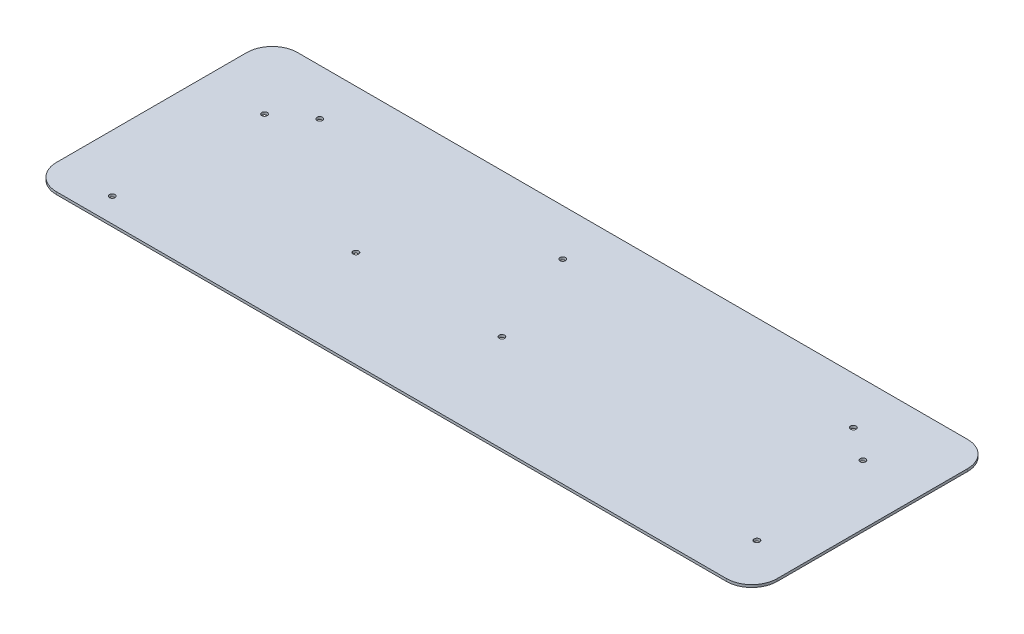
ISO-10303-21;
HEADER;
FILE_DESCRIPTION(('STEP AP214'),'2;1');
FILE_NAME('part.step','',(''),(''),'','','');
FILE_SCHEMA(('AUTOMOTIVE_DESIGN { 1 0 10303 214 1 1 1 1 }'));
ENDSEC;
DATA;
#1=APPLICATION_CONTEXT('core data for automotive mechanical design processes');
#2=APPLICATION_PROTOCOL_DEFINITION('international standard','automotive_design',2000,#1);
#3=PRODUCT_CONTEXT('',#1,'mechanical');
#4=PRODUCT('Part','Part','',(#3));
#5=PRODUCT_RELATED_PRODUCT_CATEGORY('part','',(#4));
#6=PRODUCT_DEFINITION_FORMATION('','',#4);
#7=PRODUCT_DEFINITION_CONTEXT('part definition',#1,'design');
#8=PRODUCT_DEFINITION('design','',#6,#7);
#9=PRODUCT_DEFINITION_SHAPE('','',#8);
#10=(LENGTH_UNIT() NAMED_UNIT(*) SI_UNIT(.MILLI.,.METRE.));
#11=(NAMED_UNIT(*) PLANE_ANGLE_UNIT() SI_UNIT($,.RADIAN.));
#12=(NAMED_UNIT(*) SI_UNIT($,.STERADIAN.) SOLID_ANGLE_UNIT());
#13=UNCERTAINTY_MEASURE_WITH_UNIT(LENGTH_MEASURE(1.E-05),#10,'distance_accuracy_value','');
#14=(GEOMETRIC_REPRESENTATION_CONTEXT(3) GLOBAL_UNCERTAINTY_ASSIGNED_CONTEXT((#13)) GLOBAL_UNIT_ASSIGNED_CONTEXT((#10,
#11,#12)) REPRESENTATION_CONTEXT('',''));
#15=CARTESIAN_POINT('',(0.,0.,0.));
#16=DIRECTION('',(0.,0.,1.));
#17=DIRECTION('',(1.,0.,0.));
#18=AXIS2_PLACEMENT_3D('',#15,#16,#17);
#19=CARTESIAN_POINT('',(0.,0.,0.));
#20=DIRECTION('',(0.,-1.,0.));
#21=DIRECTION('',(0.,0.,-1.));
#22=AXIS2_PLACEMENT_3D('',#19,#20,#21);
#23=PLANE('',#22);
#24=CARTESIAN_POINT('',(48.2656569231473,0.,-388.514519521558));
#25=DIRECTION('',(0.,1.,0.));
#26=DIRECTION('',(0.,0.,1.));
#27=AXIS2_PLACEMENT_3D('',#24,#25,#26);
#28=CIRCLE('',#27,1.1);
#29=CARTESIAN_POINT('',(48.2656569231473,0.,-387.414519521558));
#30=VERTEX_POINT('',#29);
#31=EDGE_CURVE('E225',#30,#30,#28,.T.);
#32=ORIENTED_EDGE('',*,*,#31,.T.);
#33=EDGE_LOOP('',(#32));
#34=FACE_BOUND('',#33,.T.);
#35=CARTESIAN_POINT('',(60.7656569231473,0.,-397.764519521558));
#36=DIRECTION('',(0.,1.,0.));
#37=DIRECTION('',(0.,0.,1.));
#38=AXIS2_PLACEMENT_3D('',#35,#36,#37);
#39=CIRCLE('',#38,1.1);
#40=CARTESIAN_POINT('',(60.7656569231473,0.,-396.664519521558));
#41=VERTEX_POINT('',#40);
#42=EDGE_CURVE('E219',#41,#41,#39,.T.);
#43=ORIENTED_EDGE('',*,*,#42,.T.);
#44=EDGE_LOOP('',(#43));
#45=FACE_BOUND('',#44,.T.);
#46=CARTESIAN_POINT('',(46.2656569231473,0.,-330.514519521558));
#47=DIRECTION('',(0.,1.,0.));
#48=DIRECTION('',(0.,0.,1.));
#49=AXIS2_PLACEMENT_3D('',#46,#47,#48);
#50=CIRCLE('',#49,1.1);
#51=CARTESIAN_POINT('',(46.2656569231473,0.,-329.414519521558));
#52=VERTEX_POINT('',#51);
#53=EDGE_CURVE('E213',#52,#52,#50,.T.);
#54=ORIENTED_EDGE('',*,*,#53,.T.);
#55=EDGE_LOOP('',(#54));
#56=FACE_BOUND('',#55,.T.);
#57=CARTESIAN_POINT('',(113.515656923147,0.,-359.264519521558));
#58=DIRECTION('',(0.,1.,0.));
#59=DIRECTION('',(0.,0.,1.));
#60=AXIS2_PLACEMENT_3D('',#57,#58,#59);
#61=CIRCLE('',#60,1.1);
#62=CARTESIAN_POINT('',(113.515656923147,0.,-358.164519521558));
#63=VERTEX_POINT('',#62);
#64=EDGE_CURVE('E207',#63,#63,#61,.T.);
#65=ORIENTED_EDGE('',*,*,#64,.T.);
#66=EDGE_LOOP('',(#65));
#67=FACE_BOUND('',#66,.T.);
#68=CARTESIAN_POINT('',(156.515656923147,0.,-397.764519521558));
#69=DIRECTION('',(0.,1.,0.));
#70=DIRECTION('',(0.,0.,1.));
#71=AXIS2_PLACEMENT_3D('',#68,#69,#70);
#72=CIRCLE('',#71,1.09999999999999);
#73=CARTESIAN_POINT('',(156.515656923147,0.,-396.664519521558));
#74=VERTEX_POINT('',#73);
#75=EDGE_CURVE('E201',#74,#74,#72,.T.);
#76=ORIENTED_EDGE('',*,*,#75,.T.);
#77=EDGE_LOOP('',(#76));
#78=FACE_BOUND('',#77,.T.);
#79=DIRECTION('',(-1.,0.,0.));
#80=VECTOR('',#79,1.);
#81=CARTESIAN_POINT('',(23.7656569231473,0.,-416.014519521558));
#82=LINE('',#81,#80);
#83=CARTESIAN_POINT('',(297.765656923147,0.,-416.014519521558));
#84=VERTEX_POINT('',#83);
#85=CARTESIAN_POINT('',(33.7656569231473,0.,-416.014519521558));
#86=VERTEX_POINT('',#85);
#87=EDGE_CURVE('E123',#84,#86,#82,.T.);
#88=ORIENTED_EDGE('',*,*,#87,.F.);
#89=CARTESIAN_POINT('',(297.765656923147,0.,-406.014519521558));
#90=DIRECTION('',(0.,-1.,0.));
#91=DIRECTION('',(0.,0.,-1.));
#92=AXIS2_PLACEMENT_3D('',#89,#90,#91);
#93=CIRCLE('',#92,10.);
#94=CARTESIAN_POINT('',(307.765656923147,0.,-406.014519521558));
#95=VERTEX_POINT('',#94);
#96=EDGE_CURVE('E106',#84,#95,#93,.T.);
#97=ORIENTED_EDGE('',*,*,#96,.T.);
#98=DIRECTION('',(0.,0.,-1.));
#99=VECTOR('',#98,1.);
#100=CARTESIAN_POINT('',(307.765656923147,0.,-321.014519521558));
#101=LINE('',#100,#99);
#102=CARTESIAN_POINT('',(307.765656923147,0.,-331.014519521558));
#103=VERTEX_POINT('',#102);
#104=EDGE_CURVE('E133',#103,#95,#101,.T.);
#105=ORIENTED_EDGE('',*,*,#104,.F.);
#106=CARTESIAN_POINT('',(297.765656923147,0.,-331.014519521558));
#107=DIRECTION('',(0.,-1.,0.));
#108=DIRECTION('',(0.,0.,-1.));
#109=AXIS2_PLACEMENT_3D('',#106,#107,#108);
#110=CIRCLE('',#109,10.);
#111=CARTESIAN_POINT('',(297.765656923147,0.,-321.014519521558));
#112=VERTEX_POINT('',#111);
#113=EDGE_CURVE('E117',#103,#112,#110,.T.);
#114=ORIENTED_EDGE('',*,*,#113,.T.);
#115=DIRECTION('',(1.,0.,0.));
#116=VECTOR('',#115,1.);
#117=CARTESIAN_POINT('',(23.7656569231473,0.,-321.014519521558));
#118=LINE('',#117,#116);
#119=CARTESIAN_POINT('',(33.7656569231473,0.,-321.014519521558));
#120=VERTEX_POINT('',#119);
#121=EDGE_CURVE('E137',#120,#112,#118,.T.);
#122=ORIENTED_EDGE('',*,*,#121,.F.);
#123=CARTESIAN_POINT('',(33.7656569231473,0.,-331.014519521558));
#124=DIRECTION('',(0.,-1.,0.));
#125=DIRECTION('',(0.,0.,-1.));
#126=AXIS2_PLACEMENT_3D('',#123,#124,#125);
#127=CIRCLE('',#126,10.);
#128=CARTESIAN_POINT('',(23.7656569231473,0.,-331.014519521558));
#129=VERTEX_POINT('',#128);
#130=EDGE_CURVE('E143',#120,#129,#127,.T.);
#131=ORIENTED_EDGE('',*,*,#130,.T.);
#132=DIRECTION('',(0.,0.,1.));
#133=VECTOR('',#132,1.);
#134=CARTESIAN_POINT('',(23.7656569231473,0.,-321.014519521558));
#135=LINE('',#134,#133);
#136=CARTESIAN_POINT('',(23.7656569231473,0.,-406.014519521558));
#137=VERTEX_POINT('',#136);
#138=EDGE_CURVE('E165',#137,#129,#135,.T.);
#139=ORIENTED_EDGE('',*,*,#138,.F.);
#140=CARTESIAN_POINT('',(33.7656569231473,0.,-406.014519521558));
#141=DIRECTION('',(0.,-1.,0.));
#142=DIRECTION('',(0.,0.,-1.));
#143=AXIS2_PLACEMENT_3D('',#140,#141,#142);
#144=CIRCLE('',#143,10.);
#145=EDGE_CURVE('E127',#137,#86,#144,.T.);
#146=ORIENTED_EDGE('',*,*,#145,.T.);
#147=EDGE_LOOP('',(#88,#97,#105,#114,#122,#131,#139,#146));
#148=FACE_BOUND('',#147,.T.);
#149=CARTESIAN_POINT('',(290.765656923147,0.,-340.014519521558));
#150=DIRECTION('',(0.,1.,0.));
#151=DIRECTION('',(0.,0.,1.));
#152=AXIS2_PLACEMENT_3D('',#149,#150,#151);
#153=CIRCLE('',#152,1.09999999999999);
#154=CARTESIAN_POINT('',(290.765656923147,0.,-338.914519521558));
#155=VERTEX_POINT('',#154);
#156=EDGE_CURVE('E170',#155,#155,#153,.T.);
#157=ORIENTED_EDGE('',*,*,#156,.T.);
#158=EDGE_LOOP('',(#157));
#159=FACE_BOUND('',#158,.T.);
#160=CARTESIAN_POINT('',(284.265656923147,0.,-388.264519521558));
#161=DIRECTION('',(0.,1.,0.));
#162=DIRECTION('',(0.,0.,1.));
#163=AXIS2_PLACEMENT_3D('',#160,#161,#162);
#164=CIRCLE('',#163,1.09999999999999);
#165=CARTESIAN_POINT('',(284.265656923147,0.,-387.164519521558));
#166=VERTEX_POINT('',#165);
#167=EDGE_CURVE('E183',#166,#166,#164,.T.);
#168=ORIENTED_EDGE('',*,*,#167,.T.);
#169=EDGE_LOOP('',(#168));
#170=FACE_BOUND('',#169,.T.);
#171=CARTESIAN_POINT('',(271.265656923147,0.,-397.514519521558));
#172=DIRECTION('',(0.,1.,0.));
#173=DIRECTION('',(0.,0.,1.));
#174=AXIS2_PLACEMENT_3D('',#171,#172,#173);
#175=CIRCLE('',#174,1.09999999999999);
#176=CARTESIAN_POINT('',(271.265656923147,0.,-396.414519521558));
#177=VERTEX_POINT('',#176);
#178=EDGE_CURVE('E189',#177,#177,#175,.T.);
#179=ORIENTED_EDGE('',*,*,#178,.T.);
#180=EDGE_LOOP('',(#179));
#181=FACE_BOUND('',#180,.T.);
#182=CARTESIAN_POINT('',(171.015656923147,0.,-359.264519521558));
#183=DIRECTION('',(0.,1.,0.));
#184=DIRECTION('',(0.,0.,1.));
#185=AXIS2_PLACEMENT_3D('',#182,#183,#184);
#186=CIRCLE('',#185,1.09999999999999);
#187=CARTESIAN_POINT('',(171.015656923147,0.,-358.164519521558));
#188=VERTEX_POINT('',#187);
#189=EDGE_CURVE('E195',#188,#188,#186,.T.);
#190=ORIENTED_EDGE('',*,*,#189,.T.);
#191=EDGE_LOOP('',(#190));
#192=FACE_BOUND('',#191,.T.);
#193=ADVANCED_FACE('F40',(#34,#45,#56,#67,#78,#148,#159,#170,#181,#192),#23,.T.);
#194=CARTESIAN_POINT('',(23.7656569231473,1.,-321.014519521558));
#195=DIRECTION('',(1.,0.,0.));
#196=DIRECTION('',(0.,0.,-1.));
#197=AXIS2_PLACEMENT_3D('',#194,#195,#196);
#198=PLANE('',#197);
#199=ORIENTED_EDGE('',*,*,#138,.T.);
#200=DIRECTION('',(0.,-1.,0.));
#201=VECTOR('',#200,1.);
#202=CARTESIAN_POINT('',(23.7656569231473,1.,-331.014519521558));
#203=LINE('',#202,#201);
#204=CARTESIAN_POINT('',(23.7656569231473,1.,-331.014519521558));
#205=VERTEX_POINT('',#204);
#206=EDGE_CURVE('E11',#129,#205,#203,.F.);
#207=ORIENTED_EDGE('',*,*,#206,.T.);
#208=DIRECTION('',(0.,0.,1.));
#209=VECTOR('',#208,1.);
#210=CARTESIAN_POINT('',(23.7656569231473,1.,-321.014519521558));
#211=LINE('',#210,#209);
#212=CARTESIAN_POINT('',(23.7656569231473,1.,-406.014519521558));
#213=VERTEX_POINT('',#212);
#214=EDGE_CURVE('E132',#213,#205,#211,.T.);
#215=ORIENTED_EDGE('',*,*,#214,.F.);
#216=DIRECTION('',(0.,-1.,0.));
#217=VECTOR('',#216,1.);
#218=CARTESIAN_POINT('',(23.7656569231473,1.,-406.014519521558));
#219=LINE('',#218,#217);
#220=EDGE_CURVE('E48',#213,#137,#219,.T.);
#221=ORIENTED_EDGE('',*,*,#220,.T.);
#222=EDGE_LOOP('',(#199,#207,#215,#221));
#223=FACE_BOUND('',#222,.T.);
#224=ADVANCED_FACE('F164',(#223),#198,.F.);
#225=CARTESIAN_POINT('',(23.7656569231473,1.,-321.014519521558));
#226=DIRECTION('',(0.,0.,-1.));
#227=DIRECTION('',(-1.,0.,0.));
#228=AXIS2_PLACEMENT_3D('',#225,#226,#227);
#229=PLANE('',#228);
#230=ORIENTED_EDGE('',*,*,#121,.T.);
#231=DIRECTION('',(0.,-1.,0.));
#232=VECTOR('',#231,1.);
#233=CARTESIAN_POINT('',(297.765656923147,1.,-321.014519521558));
#234=LINE('',#233,#232);
#235=CARTESIAN_POINT('',(297.765656923147,1.,-321.014519521558));
#236=VERTEX_POINT('',#235);
#237=EDGE_CURVE('E55',#112,#236,#234,.F.);
#238=ORIENTED_EDGE('',*,*,#237,.T.);
#239=DIRECTION('',(1.,0.,0.));
#240=VECTOR('',#239,1.);
#241=CARTESIAN_POINT('',(23.7656569231473,1.,-321.014519521558));
#242=LINE('',#241,#240);
#243=CARTESIAN_POINT('',(33.7656569231473,1.,-321.014519521558));
#244=VERTEX_POINT('',#243);
#245=EDGE_CURVE('E135',#244,#236,#242,.T.);
#246=ORIENTED_EDGE('',*,*,#245,.F.);
#247=DIRECTION('',(0.,-1.,0.));
#248=VECTOR('',#247,1.);
#249=CARTESIAN_POINT('',(33.7656569231473,1.,-321.014519521558));
#250=LINE('',#249,#248);
#251=EDGE_CURVE('E156',#244,#120,#250,.T.);
#252=ORIENTED_EDGE('',*,*,#251,.T.);
#253=EDGE_LOOP('',(#230,#238,#246,#252));
#254=FACE_BOUND('',#253,.T.);
#255=ADVANCED_FACE('F261',(#254),#229,.F.);
#256=CARTESIAN_POINT('',(307.765656923147,1.,-321.014519521558));
#257=DIRECTION('',(-1.,0.,0.));
#258=DIRECTION('',(0.,0.,1.));
#259=AXIS2_PLACEMENT_3D('',#256,#257,#258);
#260=PLANE('',#259);
#261=ORIENTED_EDGE('',*,*,#104,.T.);
#262=DIRECTION('',(0.,-1.,0.));
#263=VECTOR('',#262,1.);
#264=CARTESIAN_POINT('',(307.765656923147,1.,-406.014519521558));
#265=LINE('',#264,#263);
#266=CARTESIAN_POINT('',(307.765656923147,1.,-406.014519521558));
#267=VERTEX_POINT('',#266);
#268=EDGE_CURVE('E111',#95,#267,#265,.F.);
#269=ORIENTED_EDGE('',*,*,#268,.T.);
#270=DIRECTION('',(0.,0.,-1.));
#271=VECTOR('',#270,1.);
#272=CARTESIAN_POINT('',(307.765656923147,1.,-321.014519521558));
#273=LINE('',#272,#271);
#274=CARTESIAN_POINT('',(307.765656923147,1.,-331.014519521558));
#275=VERTEX_POINT('',#274);
#276=EDGE_CURVE('E177',#275,#267,#273,.T.);
#277=ORIENTED_EDGE('',*,*,#276,.F.);
#278=DIRECTION('',(0.,-1.,0.));
#279=VECTOR('',#278,1.);
#280=CARTESIAN_POINT('',(307.765656923147,1.,-331.014519521558));
#281=LINE('',#280,#279);
#282=EDGE_CURVE('E116',#275,#103,#281,.T.);
#283=ORIENTED_EDGE('',*,*,#282,.T.);
#284=EDGE_LOOP('',(#261,#269,#277,#283));
#285=FACE_BOUND('',#284,.T.);
#286=ADVANCED_FACE('F258',(#285),#260,.F.);
#287=CARTESIAN_POINT('',(23.7656569231473,1.,-416.014519521558));
#288=DIRECTION('',(0.,0.,1.));
#289=DIRECTION('',(1.,0.,0.));
#290=AXIS2_PLACEMENT_3D('',#287,#288,#289);
#291=PLANE('',#290);
#292=DIRECTION('',(-1.,0.,0.));
#293=VECTOR('',#292,1.);
#294=CARTESIAN_POINT('',(23.7656569231473,1.,-416.014519521558));
#295=LINE('',#294,#293);
#296=CARTESIAN_POINT('',(297.765656923147,1.,-416.014519521558));
#297=VERTEX_POINT('',#296);
#298=CARTESIAN_POINT('',(33.7656569231473,1.,-416.014519521558));
#299=VERTEX_POINT('',#298);
#300=EDGE_CURVE('E126',#297,#299,#295,.T.);
#301=ORIENTED_EDGE('',*,*,#300,.F.);
#302=DIRECTION('',(0.,-1.,0.));
#303=VECTOR('',#302,1.);
#304=CARTESIAN_POINT('',(297.765656923147,1.,-416.014519521558));
#305=LINE('',#304,#303);
#306=EDGE_CURVE('E110',#297,#84,#305,.T.);
#307=ORIENTED_EDGE('',*,*,#306,.T.);
#308=ORIENTED_EDGE('',*,*,#87,.T.);
#309=DIRECTION('',(0.,-1.,0.));
#310=VECTOR('',#309,1.);
#311=CARTESIAN_POINT('',(33.7656569231473,1.,-416.014519521558));
#312=LINE('',#311,#310);
#313=EDGE_CURVE('E128',#86,#299,#312,.F.);
#314=ORIENTED_EDGE('',*,*,#313,.T.);
#315=EDGE_LOOP('',(#301,#307,#308,#314));
#316=FACE_BOUND('',#315,.T.);
#317=ADVANCED_FACE('F122',(#316),#291,.F.);
#318=CARTESIAN_POINT('',(0.,1.,0.));
#319=DIRECTION('',(0.,-1.,0.));
#320=DIRECTION('',(0.,0.,-1.));
#321=AXIS2_PLACEMENT_3D('',#318,#319,#320);
#322=PLANE('',#321);
#323=CARTESIAN_POINT('',(48.2656569231473,1.,-388.514519521558));
#324=DIRECTION('',(0.,1.,0.));
#325=DIRECTION('',(0.,0.,1.));
#326=AXIS2_PLACEMENT_3D('',#323,#324,#325);
#327=CIRCLE('',#326,1.1);
#328=CARTESIAN_POINT('',(48.2656569231473,1.,-387.414519521558));
#329=VERTEX_POINT('',#328);
#330=EDGE_CURVE('E228',#329,#329,#327,.T.);
#331=ORIENTED_EDGE('',*,*,#330,.F.);
#332=EDGE_LOOP('',(#331));
#333=FACE_BOUND('',#332,.T.);
#334=CARTESIAN_POINT('',(60.7656569231473,1.,-397.764519521558));
#335=DIRECTION('',(0.,1.,0.));
#336=DIRECTION('',(0.,0.,1.));
#337=AXIS2_PLACEMENT_3D('',#334,#335,#336);
#338=CIRCLE('',#337,1.1);
#339=CARTESIAN_POINT('',(60.7656569231473,1.,-396.664519521558));
#340=VERTEX_POINT('',#339);
#341=EDGE_CURVE('E222',#340,#340,#338,.T.);
#342=ORIENTED_EDGE('',*,*,#341,.F.);
#343=EDGE_LOOP('',(#342));
#344=FACE_BOUND('',#343,.T.);
#345=CARTESIAN_POINT('',(46.2656569231473,1.,-330.514519521558));
#346=DIRECTION('',(0.,1.,0.));
#347=DIRECTION('',(0.,0.,1.));
#348=AXIS2_PLACEMENT_3D('',#345,#346,#347);
#349=CIRCLE('',#348,1.1);
#350=CARTESIAN_POINT('',(46.2656569231473,1.,-329.414519521558));
#351=VERTEX_POINT('',#350);
#352=EDGE_CURVE('E216',#351,#351,#349,.T.);
#353=ORIENTED_EDGE('',*,*,#352,.F.);
#354=EDGE_LOOP('',(#353));
#355=FACE_BOUND('',#354,.T.);
#356=CARTESIAN_POINT('',(113.515656923147,1.,-359.264519521558));
#357=DIRECTION('',(0.,1.,0.));
#358=DIRECTION('',(0.,0.,1.));
#359=AXIS2_PLACEMENT_3D('',#356,#357,#358);
#360=CIRCLE('',#359,1.1);
#361=CARTESIAN_POINT('',(113.515656923147,1.,-358.164519521558));
#362=VERTEX_POINT('',#361);
#363=EDGE_CURVE('E210',#362,#362,#360,.T.);
#364=ORIENTED_EDGE('',*,*,#363,.F.);
#365=EDGE_LOOP('',(#364));
#366=FACE_BOUND('',#365,.T.);
#367=CARTESIAN_POINT('',(156.515656923147,1.,-397.764519521558));
#368=DIRECTION('',(0.,1.,0.));
#369=DIRECTION('',(0.,0.,1.));
#370=AXIS2_PLACEMENT_3D('',#367,#368,#369);
#371=CIRCLE('',#370,1.09999999999999);
#372=CARTESIAN_POINT('',(156.515656923147,1.,-396.664519521558));
#373=VERTEX_POINT('',#372);
#374=EDGE_CURVE('E204',#373,#373,#371,.T.);
#375=ORIENTED_EDGE('',*,*,#374,.F.);
#376=EDGE_LOOP('',(#375));
#377=FACE_BOUND('',#376,.T.);
#378=CARTESIAN_POINT('',(171.015656923147,1.,-359.264519521558));
#379=DIRECTION('',(0.,1.,0.));
#380=DIRECTION('',(0.,0.,1.));
#381=AXIS2_PLACEMENT_3D('',#378,#379,#380);
#382=CIRCLE('',#381,1.09999999999999);
#383=CARTESIAN_POINT('',(171.015656923147,1.,-358.164519521558));
#384=VERTEX_POINT('',#383);
#385=EDGE_CURVE('E198',#384,#384,#382,.T.);
#386=ORIENTED_EDGE('',*,*,#385,.F.);
#387=EDGE_LOOP('',(#386));
#388=FACE_BOUND('',#387,.T.);
#389=CARTESIAN_POINT('',(271.265656923147,1.,-397.514519521558));
#390=DIRECTION('',(0.,1.,0.));
#391=DIRECTION('',(0.,0.,1.));
#392=AXIS2_PLACEMENT_3D('',#389,#390,#391);
#393=CIRCLE('',#392,1.09999999999999);
#394=CARTESIAN_POINT('',(271.265656923147,1.,-396.414519521558));
#395=VERTEX_POINT('',#394);
#396=EDGE_CURVE('E192',#395,#395,#393,.T.);
#397=ORIENTED_EDGE('',*,*,#396,.F.);
#398=EDGE_LOOP('',(#397));
#399=FACE_BOUND('',#398,.T.);
#400=CARTESIAN_POINT('',(284.265656923147,1.,-388.264519521558));
#401=DIRECTION('',(0.,1.,0.));
#402=DIRECTION('',(0.,0.,1.));
#403=AXIS2_PLACEMENT_3D('',#400,#401,#402);
#404=CIRCLE('',#403,1.09999999999999);
#405=CARTESIAN_POINT('',(284.265656923147,1.,-387.164519521558));
#406=VERTEX_POINT('',#405);
#407=EDGE_CURVE('E186',#406,#406,#404,.T.);
#408=ORIENTED_EDGE('',*,*,#407,.F.);
#409=EDGE_LOOP('',(#408));
#410=FACE_BOUND('',#409,.T.);
#411=CARTESIAN_POINT('',(290.765656923147,1.,-340.014519521558));
#412=DIRECTION('',(0.,1.,0.));
#413=DIRECTION('',(0.,0.,1.));
#414=AXIS2_PLACEMENT_3D('',#411,#412,#413);
#415=CIRCLE('',#414,1.09999999999999);
#416=CARTESIAN_POINT('',(290.765656923147,1.,-338.914519521558));
#417=VERTEX_POINT('',#416);
#418=EDGE_CURVE('E173',#417,#417,#415,.T.);
#419=ORIENTED_EDGE('',*,*,#418,.F.);
#420=EDGE_LOOP('',(#419));
#421=FACE_BOUND('',#420,.T.);
#422=ORIENTED_EDGE('',*,*,#276,.T.);
#423=CARTESIAN_POINT('',(297.765656923147,1.,-406.014519521558));
#424=DIRECTION('',(0.,-1.,0.));
#425=DIRECTION('',(0.,0.,-1.));
#426=AXIS2_PLACEMENT_3D('',#423,#424,#425);
#427=CIRCLE('',#426,10.);
#428=EDGE_CURVE('E154',#267,#297,#427,.F.);
#429=ORIENTED_EDGE('',*,*,#428,.T.);
#430=ORIENTED_EDGE('',*,*,#300,.T.);
#431=CARTESIAN_POINT('',(33.7656569231473,1.,-406.014519521558));
#432=DIRECTION('',(0.,-1.,0.));
#433=DIRECTION('',(0.,0.,-1.));
#434=AXIS2_PLACEMENT_3D('',#431,#432,#433);
#435=CIRCLE('',#434,10.);
#436=EDGE_CURVE('E149',#299,#213,#435,.F.);
#437=ORIENTED_EDGE('',*,*,#436,.T.);
#438=ORIENTED_EDGE('',*,*,#214,.T.);
#439=CARTESIAN_POINT('',(33.7656569231473,1.,-331.014519521558));
#440=DIRECTION('',(0.,-1.,0.));
#441=DIRECTION('',(0.,0.,-1.));
#442=AXIS2_PLACEMENT_3D('',#439,#440,#441);
#443=CIRCLE('',#442,10.);
#444=EDGE_CURVE('E62',#205,#244,#443,.F.);
#445=ORIENTED_EDGE('',*,*,#444,.T.);
#446=ORIENTED_EDGE('',*,*,#245,.T.);
#447=CARTESIAN_POINT('',(297.765656923147,1.,-331.014519521558));
#448=DIRECTION('',(0.,-1.,0.));
#449=DIRECTION('',(0.,0.,-1.));
#450=AXIS2_PLACEMENT_3D('',#447,#448,#449);
#451=CIRCLE('',#450,10.);
#452=EDGE_CURVE('E152',#236,#275,#451,.F.);
#453=ORIENTED_EDGE('',*,*,#452,.T.);
#454=EDGE_LOOP('',(#422,#429,#430,#437,#438,#445,#446,#453));
#455=FACE_BOUND('',#454,.T.);
#456=ADVANCED_FACE('F234',(#333,#344,#355,#366,#377,#388,#399,#410,#421,#455),#322,.F.);
#457=CARTESIAN_POINT('',(290.765656923147,1.,-340.014519521558));
#458=DIRECTION('',(0.,1.,0.));
#459=DIRECTION('',(0.,0.,1.));
#460=AXIS2_PLACEMENT_3D('',#457,#458,#459);
#461=CYLINDRICAL_SURFACE('',#460,1.09999999999999);
#462=ORIENTED_EDGE('',*,*,#156,.F.);
#463=EDGE_LOOP('',(#462));
#464=FACE_BOUND('',#463,.T.);
#465=ORIENTED_EDGE('',*,*,#418,.T.);
#466=EDGE_LOOP('',(#465));
#467=FACE_BOUND('',#466,.T.);
#468=ADVANCED_FACE('F237',(#464,#467),#461,.F.);
#469=CARTESIAN_POINT('',(284.265656923147,1.,-388.264519521558));
#470=DIRECTION('',(0.,1.,0.));
#471=DIRECTION('',(0.,0.,1.));
#472=AXIS2_PLACEMENT_3D('',#469,#470,#471);
#473=CYLINDRICAL_SURFACE('',#472,1.09999999999999);
#474=ORIENTED_EDGE('',*,*,#167,.F.);
#475=EDGE_LOOP('',(#474));
#476=FACE_BOUND('',#475,.T.);
#477=ORIENTED_EDGE('',*,*,#407,.T.);
#478=EDGE_LOOP('',(#477));
#479=FACE_BOUND('',#478,.T.);
#480=ADVANCED_FACE('F372',(#476,#479),#473,.F.);
#481=CARTESIAN_POINT('',(271.265656923147,1.,-397.514519521558));
#482=DIRECTION('',(0.,1.,0.));
#483=DIRECTION('',(0.,0.,1.));
#484=AXIS2_PLACEMENT_3D('',#481,#482,#483);
#485=CYLINDRICAL_SURFACE('',#484,1.09999999999999);
#486=ORIENTED_EDGE('',*,*,#178,.F.);
#487=EDGE_LOOP('',(#486));
#488=FACE_BOUND('',#487,.T.);
#489=ORIENTED_EDGE('',*,*,#396,.T.);
#490=EDGE_LOOP('',(#489));
#491=FACE_BOUND('',#490,.T.);
#492=ADVANCED_FACE('F363',(#488,#491),#485,.F.);
#493=CARTESIAN_POINT('',(171.015656923147,1.,-359.264519521558));
#494=DIRECTION('',(0.,1.,0.));
#495=DIRECTION('',(0.,0.,1.));
#496=AXIS2_PLACEMENT_3D('',#493,#494,#495);
#497=CYLINDRICAL_SURFACE('',#496,1.09999999999999);
#498=ORIENTED_EDGE('',*,*,#189,.F.);
#499=EDGE_LOOP('',(#498));
#500=FACE_BOUND('',#499,.T.);
#501=ORIENTED_EDGE('',*,*,#385,.T.);
#502=EDGE_LOOP('',(#501));
#503=FACE_BOUND('',#502,.T.);
#504=ADVANCED_FACE('F354',(#500,#503),#497,.F.);
#505=CARTESIAN_POINT('',(156.515656923147,1.,-397.764519521558));
#506=DIRECTION('',(0.,1.,0.));
#507=DIRECTION('',(0.,0.,1.));
#508=AXIS2_PLACEMENT_3D('',#505,#506,#507);
#509=CYLINDRICAL_SURFACE('',#508,1.09999999999999);
#510=ORIENTED_EDGE('',*,*,#75,.F.);
#511=EDGE_LOOP('',(#510));
#512=FACE_BOUND('',#511,.T.);
#513=ORIENTED_EDGE('',*,*,#374,.T.);
#514=EDGE_LOOP('',(#513));
#515=FACE_BOUND('',#514,.T.);
#516=ADVANCED_FACE('F345',(#512,#515),#509,.F.);
#517=CARTESIAN_POINT('',(113.515656923147,1.,-359.264519521558));
#518=DIRECTION('',(0.,1.,0.));
#519=DIRECTION('',(0.,0.,1.));
#520=AXIS2_PLACEMENT_3D('',#517,#518,#519);
#521=CYLINDRICAL_SURFACE('',#520,1.1);
#522=ORIENTED_EDGE('',*,*,#64,.F.);
#523=EDGE_LOOP('',(#522));
#524=FACE_BOUND('',#523,.T.);
#525=ORIENTED_EDGE('',*,*,#363,.T.);
#526=EDGE_LOOP('',(#525));
#527=FACE_BOUND('',#526,.T.);
#528=ADVANCED_FACE('F336',(#524,#527),#521,.F.);
#529=CARTESIAN_POINT('',(46.2656569231473,1.,-330.514519521558));
#530=DIRECTION('',(0.,1.,0.));
#531=DIRECTION('',(0.,0.,1.));
#532=AXIS2_PLACEMENT_3D('',#529,#530,#531);
#533=CYLINDRICAL_SURFACE('',#532,1.1);
#534=ORIENTED_EDGE('',*,*,#53,.F.);
#535=EDGE_LOOP('',(#534));
#536=FACE_BOUND('',#535,.T.);
#537=ORIENTED_EDGE('',*,*,#352,.T.);
#538=EDGE_LOOP('',(#537));
#539=FACE_BOUND('',#538,.T.);
#540=ADVANCED_FACE('F327',(#536,#539),#533,.F.);
#541=CARTESIAN_POINT('',(60.7656569231473,1.,-397.764519521558));
#542=DIRECTION('',(0.,1.,0.));
#543=DIRECTION('',(0.,0.,1.));
#544=AXIS2_PLACEMENT_3D('',#541,#542,#543);
#545=CYLINDRICAL_SURFACE('',#544,1.1);
#546=ORIENTED_EDGE('',*,*,#42,.F.);
#547=EDGE_LOOP('',(#546));
#548=FACE_BOUND('',#547,.T.);
#549=ORIENTED_EDGE('',*,*,#341,.T.);
#550=EDGE_LOOP('',(#549));
#551=FACE_BOUND('',#550,.T.);
#552=ADVANCED_FACE('F317',(#548,#551),#545,.F.);
#553=CARTESIAN_POINT('',(48.2656569231473,1.,-388.514519521558));
#554=DIRECTION('',(0.,1.,0.));
#555=DIRECTION('',(0.,0.,1.));
#556=AXIS2_PLACEMENT_3D('',#553,#554,#555);
#557=CYLINDRICAL_SURFACE('',#556,1.1);
#558=ORIENTED_EDGE('',*,*,#31,.F.);
#559=EDGE_LOOP('',(#558));
#560=FACE_BOUND('',#559,.T.);
#561=ORIENTED_EDGE('',*,*,#330,.T.);
#562=EDGE_LOOP('',(#561));
#563=FACE_BOUND('',#562,.T.);
#564=ADVANCED_FACE('F232',(#560,#563),#557,.F.);
#565=CARTESIAN_POINT('',(297.765656923147,1.,-406.014519521558));
#566=DIRECTION('',(0.,-1.,0.));
#567=DIRECTION('',(0.,0.,-1.));
#568=AXIS2_PLACEMENT_3D('',#565,#566,#567);
#569=CYLINDRICAL_SURFACE('',#568,10.);
#570=ORIENTED_EDGE('',*,*,#428,.F.);
#571=ORIENTED_EDGE('',*,*,#268,.F.);
#572=ORIENTED_EDGE('',*,*,#96,.F.);
#573=ORIENTED_EDGE('',*,*,#306,.F.);
#574=EDGE_LOOP('',(#570,#571,#572,#573));
#575=FACE_BOUND('',#574,.T.);
#576=ADVANCED_FACE('F109',(#575),#569,.T.);
#577=CARTESIAN_POINT('',(297.765656923147,1.,-331.014519521558));
#578=DIRECTION('',(0.,-1.,0.));
#579=DIRECTION('',(0.,0.,-1.));
#580=AXIS2_PLACEMENT_3D('',#577,#578,#579);
#581=CYLINDRICAL_SURFACE('',#580,10.);
#582=ORIENTED_EDGE('',*,*,#452,.F.);
#583=ORIENTED_EDGE('',*,*,#237,.F.);
#584=ORIENTED_EDGE('',*,*,#113,.F.);
#585=ORIENTED_EDGE('',*,*,#282,.F.);
#586=EDGE_LOOP('',(#582,#583,#584,#585));
#587=FACE_BOUND('',#586,.T.);
#588=ADVANCED_FACE('F260',(#587),#581,.T.);
#589=CARTESIAN_POINT('',(33.7656569231473,1.,-331.014519521558));
#590=DIRECTION('',(0.,-1.,0.));
#591=DIRECTION('',(0.,0.,-1.));
#592=AXIS2_PLACEMENT_3D('',#589,#590,#591);
#593=CYLINDRICAL_SURFACE('',#592,10.);
#594=ORIENTED_EDGE('',*,*,#444,.F.);
#595=ORIENTED_EDGE('',*,*,#206,.F.);
#596=ORIENTED_EDGE('',*,*,#130,.F.);
#597=ORIENTED_EDGE('',*,*,#251,.F.);
#598=EDGE_LOOP('',(#594,#595,#596,#597));
#599=FACE_BOUND('',#598,.T.);
#600=ADVANCED_FACE('F264',(#599),#593,.T.);
#601=CARTESIAN_POINT('',(33.7656569231473,1.,-406.014519521558));
#602=DIRECTION('',(0.,-1.,0.));
#603=DIRECTION('',(0.,0.,-1.));
#604=AXIS2_PLACEMENT_3D('',#601,#602,#603);
#605=CYLINDRICAL_SURFACE('',#604,10.);
#606=ORIENTED_EDGE('',*,*,#436,.F.);
#607=ORIENTED_EDGE('',*,*,#313,.F.);
#608=ORIENTED_EDGE('',*,*,#145,.F.);
#609=ORIENTED_EDGE('',*,*,#220,.F.);
#610=EDGE_LOOP('',(#606,#607,#608,#609));
#611=FACE_BOUND('',#610,.T.);
#612=ADVANCED_FACE('F42',(#611),#605,.T.);
#613=CLOSED_SHELL('',(#193,#224,#255,#286,#317,#456,#468,#480,#492,#504,#516,#528,#540,#552,
#564,#576,#588,#600,#612));
#614=MANIFOLD_SOLID_BREP('B2',#613);
#615=ADVANCED_BREP_SHAPE_REPRESENTATION('',(#18,#614),#14);
#616=SHAPE_DEFINITION_REPRESENTATION(#9,#615);
ENDSEC;
END-ISO-10303-21;
